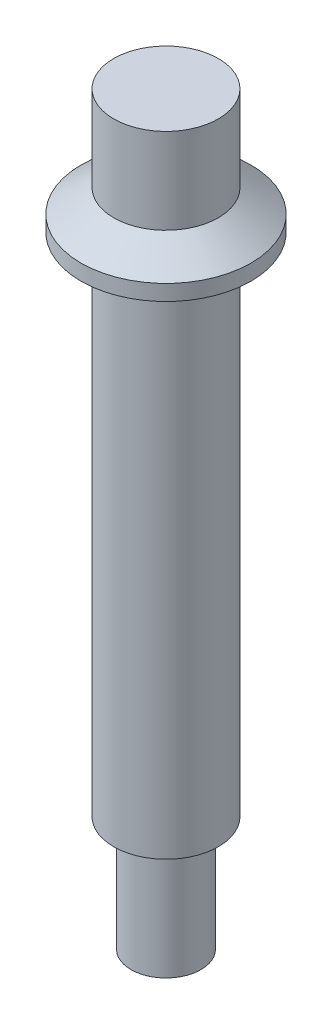
ISO-10303-21;
HEADER;
FILE_DESCRIPTION(('STEP AP214'),'2;1');
FILE_NAME('part.step','',(''),(''),'','','');
FILE_SCHEMA(('AUTOMOTIVE_DESIGN { 1 0 10303 214 1 1 1 1 }'));
ENDSEC;
DATA;
#1=APPLICATION_CONTEXT('core data for automotive mechanical design processes');
#2=APPLICATION_PROTOCOL_DEFINITION('international standard','automotive_design',2000,#1);
#3=PRODUCT_CONTEXT('',#1,'mechanical');
#4=PRODUCT('Part','Part','',(#3));
#5=PRODUCT_RELATED_PRODUCT_CATEGORY('part','',(#4));
#6=PRODUCT_DEFINITION_FORMATION('','',#4);
#7=PRODUCT_DEFINITION_CONTEXT('part definition',#1,'design');
#8=PRODUCT_DEFINITION('design','',#6,#7);
#9=PRODUCT_DEFINITION_SHAPE('','',#8);
#10=(LENGTH_UNIT() NAMED_UNIT(*) SI_UNIT(.MILLI.,.METRE.));
#11=(NAMED_UNIT(*) PLANE_ANGLE_UNIT() SI_UNIT($,.RADIAN.));
#12=(NAMED_UNIT(*) SI_UNIT($,.STERADIAN.) SOLID_ANGLE_UNIT());
#13=UNCERTAINTY_MEASURE_WITH_UNIT(LENGTH_MEASURE(1.E-05),#10,'distance_accuracy_value','');
#14=(GEOMETRIC_REPRESENTATION_CONTEXT(3) GLOBAL_UNCERTAINTY_ASSIGNED_CONTEXT((#13)) GLOBAL_UNIT_ASSIGNED_CONTEXT((#10,
#11,#12)) REPRESENTATION_CONTEXT('',''));
#15=CARTESIAN_POINT('',(0.,0.,0.));
#16=DIRECTION('',(0.,0.,1.));
#17=DIRECTION('',(1.,0.,0.));
#18=AXIS2_PLACEMENT_3D('',#15,#16,#17);
#19=CARTESIAN_POINT('',(0.,262.227948901064,0.));
#20=DIRECTION('',(0.,1.,0.));
#21=DIRECTION('',(0.,0.,1.));
#22=AXIS2_PLACEMENT_3D('',#19,#20,#21);
#23=CYLINDRICAL_SURFACE('',#22,65.);
#24=CARTESIAN_POINT('',(0.,262.227948901064,0.));
#25=DIRECTION('',(0.,1.,0.));
#26=DIRECTION('',(0.,0.,1.));
#27=AXIS2_PLACEMENT_3D('',#24,#25,#26);
#28=CIRCLE('',#27,65.);
#29=CARTESIAN_POINT('',(0.,262.227948901064,65.));
#30=VERTEX_POINT('',#29);
#31=EDGE_CURVE('E11',#30,#30,#28,.T.);
#32=ORIENTED_EDGE('',*,*,#31,.T.);
#33=EDGE_LOOP('',(#32));
#34=FACE_BOUND('',#33,.T.);
#35=CARTESIAN_POINT('',(0.,274.227948901064,0.));
#36=DIRECTION('',(0.,1.,0.));
#37=DIRECTION('',(0.,0.,1.));
#38=AXIS2_PLACEMENT_3D('',#35,#36,#37);
#39=CIRCLE('',#38,65.);
#40=CARTESIAN_POINT('',(0.,274.227948901064,65.));
#41=VERTEX_POINT('',#40);
#42=EDGE_CURVE('E97',#41,#41,#39,.T.);
#43=ORIENTED_EDGE('',*,*,#42,.F.);
#44=EDGE_LOOP('',(#43));
#45=FACE_BOUND('',#44,.T.);
#46=ADVANCED_FACE('F53',(#34,#45),#23,.T.);
#47=CARTESIAN_POINT('',(65.,262.227948901064,0.));
#48=DIRECTION('',(0.,-1.,0.));
#49=DIRECTION('',(0.,0.,-1.));
#50=AXIS2_PLACEMENT_3D('',#47,#48,#49);
#51=PLANE('',#50);
#52=CARTESIAN_POINT('',(0.,262.227948901064,0.));
#53=DIRECTION('',(0.,1.,0.));
#54=DIRECTION('',(0.,0.,1.));
#55=AXIS2_PLACEMENT_3D('',#52,#53,#54);
#56=CIRCLE('',#55,40.);
#57=CARTESIAN_POINT('',(0.,262.227948901064,40.));
#58=VERTEX_POINT('',#57);
#59=EDGE_CURVE('E60',#58,#58,#56,.T.);
#60=ORIENTED_EDGE('',*,*,#59,.T.);
#61=EDGE_LOOP('',(#60));
#62=FACE_BOUND('',#61,.T.);
#63=ORIENTED_EDGE('',*,*,#31,.F.);
#64=EDGE_LOOP('',(#63));
#65=FACE_BOUND('',#64,.T.);
#66=ADVANCED_FACE('F117',(#62,#65),#51,.T.);
#67=CARTESIAN_POINT('',(0.,262.227948901064,0.));
#68=DIRECTION('',(0.,1.,0.));
#69=DIRECTION('',(0.,0.,1.));
#70=AXIS2_PLACEMENT_3D('',#67,#68,#69);
#71=CYLINDRICAL_SURFACE('',#70,40.);
#72=CARTESIAN_POINT('',(0.,-124.772051098936,0.));
#73=DIRECTION('',(0.,1.,0.));
#74=DIRECTION('',(0.,0.,1.));
#75=AXIS2_PLACEMENT_3D('',#72,#73,#74);
#76=CIRCLE('',#75,40.);
#77=CARTESIAN_POINT('',(0.,-124.772051098936,40.));
#78=VERTEX_POINT('',#77);
#79=EDGE_CURVE('E112',#78,#78,#76,.T.);
#80=ORIENTED_EDGE('',*,*,#79,.T.);
#81=EDGE_LOOP('',(#80));
#82=FACE_BOUND('',#81,.T.);
#83=ORIENTED_EDGE('',*,*,#59,.F.);
#84=EDGE_LOOP('',(#83));
#85=FACE_BOUND('',#84,.T.);
#86=ADVANCED_FACE('F120',(#82,#85),#71,.T.);
#87=CARTESIAN_POINT('',(39.9999999999999,-124.772051098936,0.));
#88=DIRECTION('',(0.,-1.,0.));
#89=DIRECTION('',(0.,0.,-1.));
#90=AXIS2_PLACEMENT_3D('',#87,#88,#89);
#91=PLANE('',#90);
#92=CARTESIAN_POINT('',(0.,-124.772051098936,0.));
#93=DIRECTION('',(0.,1.,0.));
#94=DIRECTION('',(0.,0.,1.));
#95=AXIS2_PLACEMENT_3D('',#92,#93,#94);
#96=CIRCLE('',#95,26.75);
#97=CARTESIAN_POINT('',(0.,-124.772051098936,26.75));
#98=VERTEX_POINT('',#97);
#99=EDGE_CURVE('E109',#98,#98,#96,.T.);
#100=ORIENTED_EDGE('',*,*,#99,.T.);
#101=EDGE_LOOP('',(#100));
#102=FACE_BOUND('',#101,.T.);
#103=ORIENTED_EDGE('',*,*,#79,.F.);
#104=EDGE_LOOP('',(#103));
#105=FACE_BOUND('',#104,.T.);
#106=ADVANCED_FACE('F122',(#102,#105),#91,.T.);
#107=CARTESIAN_POINT('',(0.,262.227948901064,0.));
#108=DIRECTION('',(0.,1.,0.));
#109=DIRECTION('',(0.,0.,1.));
#110=AXIS2_PLACEMENT_3D('',#107,#108,#109);
#111=CYLINDRICAL_SURFACE('',#110,26.75);
#112=CARTESIAN_POINT('',(0.,-212.772051098936,0.));
#113=DIRECTION('',(0.,1.,0.));
#114=DIRECTION('',(0.,0.,1.));
#115=AXIS2_PLACEMENT_3D('',#112,#113,#114);
#116=CIRCLE('',#115,26.75);
#117=CARTESIAN_POINT('',(0.,-212.772051098936,26.75));
#118=VERTEX_POINT('',#117);
#119=EDGE_CURVE('E106',#118,#118,#116,.T.);
#120=ORIENTED_EDGE('',*,*,#119,.T.);
#121=EDGE_LOOP('',(#120));
#122=FACE_BOUND('',#121,.T.);
#123=ORIENTED_EDGE('',*,*,#99,.F.);
#124=EDGE_LOOP('',(#123));
#125=FACE_BOUND('',#124,.T.);
#126=ADVANCED_FACE('F129',(#122,#125),#111,.T.);
#127=CARTESIAN_POINT('',(26.7499999999999,-212.772051098936,0.));
#128=DIRECTION('',(0.,-1.,0.));
#129=DIRECTION('',(0.,0.,-1.));
#130=AXIS2_PLACEMENT_3D('',#127,#128,#129);
#131=PLANE('',#130);
#132=CARTESIAN_POINT('',(13.8564064605511,-212.772051098936,7.99999999999987));
#133=DIRECTION('',(0.,-1.,0.));
#134=DIRECTION('',(0.,0.,-1.));
#135=AXIS2_PLACEMENT_3D('',#132,#133,#134);
#136=CIRCLE('',#135,3.5);
#137=CARTESIAN_POINT('',(13.8564064605511,-212.772051098936,4.49999999999987));
#138=VERTEX_POINT('',#137);
#139=EDGE_CURVE('E81',#138,#138,#136,.T.);
#140=ORIENTED_EDGE('',*,*,#139,.F.);
#141=EDGE_LOOP('',(#140));
#142=FACE_BOUND('',#141,.T.);
#143=CARTESIAN_POINT('',(-13.856406460551,-212.772051098936,8.00000000000007));
#144=DIRECTION('',(0.,-1.,0.));
#145=DIRECTION('',(0.,0.,-1.));
#146=AXIS2_PLACEMENT_3D('',#143,#144,#145);
#147=CIRCLE('',#146,3.5);
#148=CARTESIAN_POINT('',(-13.856406460551,-212.772051098936,4.50000000000007));
#149=VERTEX_POINT('',#148);
#150=EDGE_CURVE('E80',#149,#149,#147,.T.);
#151=ORIENTED_EDGE('',*,*,#150,.F.);
#152=EDGE_LOOP('',(#151));
#153=FACE_BOUND('',#152,.T.);
#154=CARTESIAN_POINT('',(0.,-212.772051098936,-16.));
#155=DIRECTION('',(0.,-1.,0.));
#156=DIRECTION('',(0.,0.,-1.));
#157=AXIS2_PLACEMENT_3D('',#154,#155,#156);
#158=CIRCLE('',#157,3.5);
#159=CARTESIAN_POINT('',(0.,-212.772051098936,-19.5));
#160=VERTEX_POINT('',#159);
#161=EDGE_CURVE('E91',#160,#160,#158,.T.);
#162=ORIENTED_EDGE('',*,*,#161,.F.);
#163=EDGE_LOOP('',(#162));
#164=FACE_BOUND('',#163,.T.);
#165=ORIENTED_EDGE('',*,*,#119,.F.);
#166=EDGE_LOOP('',(#165));
#167=FACE_BOUND('',#166,.T.);
#168=ADVANCED_FACE('F155',(#142,#153,#164,#167),#131,.T.);
#169=CARTESIAN_POINT('',(0.,357.227948901064,0.));
#170=DIRECTION('',(0.,1.,0.));
#171=DIRECTION('',(0.,0.,1.));
#172=AXIS2_PLACEMENT_3D('',#169,#170,#171);
#173=PLANE('',#172);
#174=CARTESIAN_POINT('',(0.,357.227948901064,0.));
#175=DIRECTION('',(0.,1.,0.));
#176=DIRECTION('',(0.,0.,1.));
#177=AXIS2_PLACEMENT_3D('',#174,#175,#176);
#178=CIRCLE('',#177,40.);
#179=CARTESIAN_POINT('',(0.,357.227948901064,40.));
#180=VERTEX_POINT('',#179);
#181=EDGE_CURVE('E103',#180,#180,#178,.T.);
#182=ORIENTED_EDGE('',*,*,#181,.T.);
#183=EDGE_LOOP('',(#182));
#184=FACE_BOUND('',#183,.T.);
#185=ADVANCED_FACE('F150',(#184),#173,.T.);
#186=CARTESIAN_POINT('',(0.,262.227948901064,0.));
#187=DIRECTION('',(0.,1.,0.));
#188=DIRECTION('',(0.,0.,1.));
#189=AXIS2_PLACEMENT_3D('',#186,#187,#188);
#190=CYLINDRICAL_SURFACE('',#189,40.);
#191=CARTESIAN_POINT('',(0.,291.733137356307,0.));
#192=DIRECTION('',(0.,1.,0.));
#193=DIRECTION('',(0.,0.,1.));
#194=AXIS2_PLACEMENT_3D('',#191,#192,#193);
#195=CIRCLE('',#194,40.);
#196=CARTESIAN_POINT('',(0.,291.733137356307,40.));
#197=VERTEX_POINT('',#196);
#198=EDGE_CURVE('E100',#197,#197,#195,.T.);
#199=ORIENTED_EDGE('',*,*,#198,.T.);
#200=EDGE_LOOP('',(#199));
#201=FACE_BOUND('',#200,.T.);
#202=ORIENTED_EDGE('',*,*,#181,.F.);
#203=EDGE_LOOP('',(#202));
#204=FACE_BOUND('',#203,.T.);
#205=ADVANCED_FACE('F144',(#201,#204),#190,.T.);
#206=CARTESIAN_POINT('',(0.,291.733137356307,0.));
#207=DIRECTION('',(0.,-1.,0.));
#208=DIRECTION('',(0.,0.,-1.));
#209=AXIS2_PLACEMENT_3D('',#206,#207,#208);
#210=CONICAL_SURFACE('',#209,40.,0.95993108859688);
#211=ORIENTED_EDGE('',*,*,#42,.T.);
#212=EDGE_LOOP('',(#211));
#213=FACE_BOUND('',#212,.T.);
#214=ORIENTED_EDGE('',*,*,#198,.F.);
#215=EDGE_LOOP('',(#214));
#216=FACE_BOUND('',#215,.T.);
#217=ADVANCED_FACE('F140',(#213,#216),#210,.T.);
#218=CARTESIAN_POINT('',(0.,-193.772051098936,-16.));
#219=DIRECTION('',(0.,-1.,0.));
#220=DIRECTION('',(0.,0.,-1.));
#221=AXIS2_PLACEMENT_3D('',#218,#219,#220);
#222=CONICAL_SURFACE('',#221,3.5,1.02974425867665);
#223=CARTESIAN_POINT('',(0.,-191.669038932339,-16.));
#224=VERTEX_POINT('',#223);
#225=VERTEX_LOOP('',#224);
#226=FACE_BOUND('',#225,.T.);
#227=CARTESIAN_POINT('',(0.,-193.772051098936,-16.));
#228=DIRECTION('',(0.,-1.,0.));
#229=DIRECTION('',(0.,0.,-1.));
#230=AXIS2_PLACEMENT_3D('',#227,#228,#229);
#231=CIRCLE('',#230,3.5);
#232=CARTESIAN_POINT('',(0.,-193.772051098936,-19.5));
#233=VERTEX_POINT('',#232);
#234=EDGE_CURVE('E94',#233,#233,#231,.T.);
#235=ORIENTED_EDGE('',*,*,#234,.T.);
#236=EDGE_LOOP('',(#235));
#237=FACE_BOUND('',#236,.T.);
#238=ADVANCED_FACE('F143',(#226,#237),#222,.F.);
#239=CARTESIAN_POINT('',(0.,-212.772051098936,-16.));
#240=DIRECTION('',(0.,-1.,0.));
#241=DIRECTION('',(0.,0.,-1.));
#242=AXIS2_PLACEMENT_3D('',#239,#240,#241);
#243=CYLINDRICAL_SURFACE('',#242,3.5);
#244=ORIENTED_EDGE('',*,*,#234,.F.);
#245=EDGE_LOOP('',(#244));
#246=FACE_BOUND('',#245,.T.);
#247=ORIENTED_EDGE('',*,*,#161,.T.);
#248=EDGE_LOOP('',(#247));
#249=FACE_BOUND('',#248,.T.);
#250=ADVANCED_FACE('F222',(#246,#249),#243,.F.);
#251=CARTESIAN_POINT('',(-13.856406460551,-193.772051098936,8.00000000000007));
#252=DIRECTION('',(0.,-1.,0.));
#253=DIRECTION('',(0.,0.,-1.));
#254=AXIS2_PLACEMENT_3D('',#251,#252,#253);
#255=CONICAL_SURFACE('',#254,3.5,1.02974425867665);
#256=CARTESIAN_POINT('',(-13.856406460551,-191.669038932339,8.00000000000007));
#257=VERTEX_POINT('',#256);
#258=VERTEX_LOOP('',#257);
#259=FACE_BOUND('',#258,.T.);
#260=CARTESIAN_POINT('',(-13.856406460551,-193.772051098936,8.00000000000007));
#261=DIRECTION('',(0.,-1.,0.));
#262=DIRECTION('',(0.,0.,-1.));
#263=AXIS2_PLACEMENT_3D('',#260,#261,#262);
#264=CIRCLE('',#263,3.5);
#265=CARTESIAN_POINT('',(-13.856406460551,-193.772051098936,4.50000000000007));
#266=VERTEX_POINT('',#265);
#267=EDGE_CURVE('E84',#266,#266,#264,.T.);
#268=ORIENTED_EDGE('',*,*,#267,.T.);
#269=EDGE_LOOP('',(#268));
#270=FACE_BOUND('',#269,.T.);
#271=ADVANCED_FACE('F230',(#259,#270),#255,.F.);
#272=CARTESIAN_POINT('',(-13.856406460551,-212.772051098936,8.00000000000007));
#273=DIRECTION('',(0.,-1.,0.));
#274=DIRECTION('',(0.,0.,-1.));
#275=AXIS2_PLACEMENT_3D('',#272,#273,#274);
#276=CYLINDRICAL_SURFACE('',#275,3.5);
#277=ORIENTED_EDGE('',*,*,#267,.F.);
#278=EDGE_LOOP('',(#277));
#279=FACE_BOUND('',#278,.T.);
#280=ORIENTED_EDGE('',*,*,#150,.T.);
#281=EDGE_LOOP('',(#280));
#282=FACE_BOUND('',#281,.T.);
#283=ADVANCED_FACE('F74',(#279,#282),#276,.F.);
#284=CARTESIAN_POINT('',(13.8564064605511,-193.772051098936,7.99999999999987));
#285=DIRECTION('',(0.,-1.,0.));
#286=DIRECTION('',(0.,0.,-1.));
#287=AXIS2_PLACEMENT_3D('',#284,#285,#286);
#288=CONICAL_SURFACE('',#287,3.5,1.02974425867665);
#289=CARTESIAN_POINT('',(13.8564064605511,-191.669038932339,7.99999999999987));
#290=VERTEX_POINT('',#289);
#291=VERTEX_LOOP('',#290);
#292=FACE_BOUND('',#291,.T.);
#293=CARTESIAN_POINT('',(13.8564064605511,-193.772051098936,7.99999999999987));
#294=DIRECTION('',(0.,-1.,0.));
#295=DIRECTION('',(0.,0.,-1.));
#296=AXIS2_PLACEMENT_3D('',#293,#294,#295);
#297=CIRCLE('',#296,3.5);
#298=CARTESIAN_POINT('',(13.8564064605511,-193.772051098936,4.49999999999988));
#299=VERTEX_POINT('',#298);
#300=EDGE_CURVE('E78',#299,#299,#297,.T.);
#301=ORIENTED_EDGE('',*,*,#300,.T.);
#302=EDGE_LOOP('',(#301));
#303=FACE_BOUND('',#302,.T.);
#304=ADVANCED_FACE('F70',(#292,#303),#288,.F.);
#305=CARTESIAN_POINT('',(13.8564064605511,-212.772051098936,7.99999999999987));
#306=DIRECTION('',(0.,-1.,0.));
#307=DIRECTION('',(0.,0.,-1.));
#308=AXIS2_PLACEMENT_3D('',#305,#306,#307);
#309=CYLINDRICAL_SURFACE('',#308,3.5);
#310=ORIENTED_EDGE('',*,*,#300,.F.);
#311=EDGE_LOOP('',(#310));
#312=FACE_BOUND('',#311,.T.);
#313=ORIENTED_EDGE('',*,*,#139,.T.);
#314=EDGE_LOOP('',(#313));
#315=FACE_BOUND('',#314,.T.);
#316=ADVANCED_FACE('F73',(#312,#315),#309,.F.);
#317=CLOSED_SHELL('',(#46,#66,#86,#106,#126,#168,#185,#205,#217,#238,#250,#271,#283,#304,#316));
#318=MANIFOLD_SOLID_BREP('B2',#317);
#319=ADVANCED_BREP_SHAPE_REPRESENTATION('',(#18,#318),#14);
#320=SHAPE_DEFINITION_REPRESENTATION(#9,#319);
ENDSEC;
END-ISO-10303-21;
